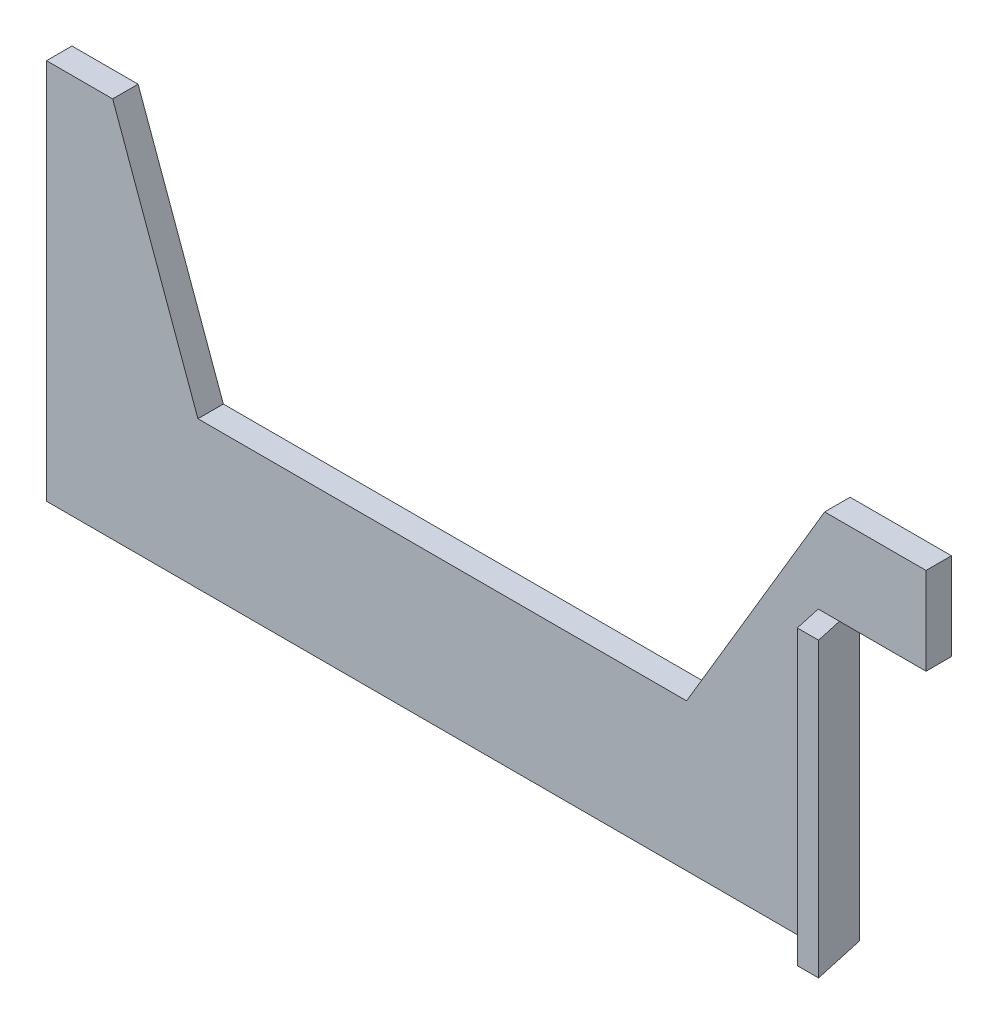
ISO-10303-21;
HEADER;
FILE_DESCRIPTION(('STEP AP214'),'2;1');
FILE_NAME('part.step','',(''),(''),'','','');
FILE_SCHEMA(('AUTOMOTIVE_DESIGN { 1 0 10303 214 1 1 1 1 }'));
ENDSEC;
DATA;
#1=APPLICATION_CONTEXT('core data for automotive mechanical design processes');
#2=APPLICATION_PROTOCOL_DEFINITION('international standard','automotive_design',2000,#1);
#3=PRODUCT_CONTEXT('',#1,'mechanical');
#4=PRODUCT('Part','Part','',(#3));
#5=PRODUCT_RELATED_PRODUCT_CATEGORY('part','',(#4));
#6=PRODUCT_DEFINITION_FORMATION('','',#4);
#7=PRODUCT_DEFINITION_CONTEXT('part definition',#1,'design');
#8=PRODUCT_DEFINITION('design','',#6,#7);
#9=PRODUCT_DEFINITION_SHAPE('','',#8);
#10=(LENGTH_UNIT() NAMED_UNIT(*) SI_UNIT(.MILLI.,.METRE.));
#11=(NAMED_UNIT(*) PLANE_ANGLE_UNIT() SI_UNIT($,.RADIAN.));
#12=(NAMED_UNIT(*) SI_UNIT($,.STERADIAN.) SOLID_ANGLE_UNIT());
#13=UNCERTAINTY_MEASURE_WITH_UNIT(LENGTH_MEASURE(1.E-05),#10,'distance_accuracy_value','');
#14=(GEOMETRIC_REPRESENTATION_CONTEXT(3) GLOBAL_UNCERTAINTY_ASSIGNED_CONTEXT((#13)) GLOBAL_UNIT_ASSIGNED_CONTEXT((#10,
#11,#12)) REPRESENTATION_CONTEXT('',''));
#15=CARTESIAN_POINT('',(0.,0.,0.));
#16=DIRECTION('',(0.,0.,1.));
#17=DIRECTION('',(1.,0.,0.));
#18=AXIS2_PLACEMENT_3D('',#15,#16,#17);
#19=CARTESIAN_POINT('',(39.8970886932972,-6.85517941773865,2.));
#20=DIRECTION('',(0.859998956605666,-0.510295791318295,0.));
#21=DIRECTION('',(0.510295791318295,0.859998956605666,0.));
#22=AXIS2_PLACEMENT_3D('',#19,#20,#21);
#23=PLANE('',#22);
#24=DIRECTION('',(-0.510295791318295,-0.859998956605666,0.));
#25=VECTOR('',#24,1.);
#26=CARTESIAN_POINT('',(39.8970886932972,-6.85517941773865,-2.));
#27=LINE('',#26,#25);
#28=CARTESIAN_POINT('',(61.6068304955443,29.7321403598319,-2.));
#29=VERTEX_POINT('',#28);
#30=CARTESIAN_POINT('',(39.8970886932972,-6.85517941773865,-2.));
#31=VERTEX_POINT('',#30);
#32=EDGE_CURVE('E172',#29,#31,#27,.T.);
#33=ORIENTED_EDGE('',*,*,#32,.T.);
#34=DIRECTION('',(0.,0.,-1.));
#35=VECTOR('',#34,1.);
#36=CARTESIAN_POINT('',(39.8970886932972,-6.85517941773865,2.));
#37=LINE('',#36,#35);
#38=CARTESIAN_POINT('',(39.8970886932972,-6.85517941773865,2.));
#39=VERTEX_POINT('',#38);
#40=EDGE_CURVE('E11',#39,#31,#37,.T.);
#41=ORIENTED_EDGE('',*,*,#40,.F.);
#42=DIRECTION('',(-0.510295791318295,-0.859998956605666,0.));
#43=VECTOR('',#42,1.);
#44=CARTESIAN_POINT('',(39.8970886932972,-6.85517941773865,2.));
#45=LINE('',#44,#43);
#46=CARTESIAN_POINT('',(61.6068304955443,29.7321403598319,2.));
#47=VERTEX_POINT('',#46);
#48=EDGE_CURVE('E152',#47,#39,#45,.T.);
#49=ORIENTED_EDGE('',*,*,#48,.F.);
#50=DIRECTION('',(0.,0.,-1.));
#51=VECTOR('',#50,1.);
#52=CARTESIAN_POINT('',(61.6068304955443,29.7321403598319,2.));
#53=LINE('',#52,#51);
#54=EDGE_CURVE('E171',#47,#29,#53,.T.);
#55=ORIENTED_EDGE('',*,*,#54,.T.);
#56=EDGE_LOOP('',(#33,#41,#49,#55));
#57=FACE_BOUND('',#56,.T.);
#58=ADVANCED_FACE('F33',(#57),#23,.F.);
#59=CARTESIAN_POINT('',(-36.9453705786578,-6.85517941773865,2.));
#60=DIRECTION('',(0.,-1.,0.));
#61=DIRECTION('',(0.,0.,-1.));
#62=AXIS2_PLACEMENT_3D('',#59,#60,#61);
#63=PLANE('',#62);
#64=DIRECTION('',(-1.,0.,0.));
#65=VECTOR('',#64,1.);
#66=CARTESIAN_POINT('',(-36.9453705786578,-6.85517941773865,-2.));
#67=LINE('',#66,#65);
#68=CARTESIAN_POINT('',(-36.9453705786578,-6.85517941773865,-2.));
#69=VERTEX_POINT('',#68);
#70=EDGE_CURVE('E175',#31,#69,#67,.T.);
#71=ORIENTED_EDGE('',*,*,#70,.T.);
#72=DIRECTION('',(0.,0.,-1.));
#73=VECTOR('',#72,1.);
#74=CARTESIAN_POINT('',(-36.9453705786578,-6.85517941773865,2.));
#75=LINE('',#74,#73);
#76=CARTESIAN_POINT('',(-36.9453705786578,-6.85517941773865,2.));
#77=VERTEX_POINT('',#76);
#78=EDGE_CURVE('E40',#77,#69,#75,.T.);
#79=ORIENTED_EDGE('',*,*,#78,.F.);
#80=DIRECTION('',(-1.,0.,0.));
#81=VECTOR('',#80,1.);
#82=CARTESIAN_POINT('',(-36.9453705786578,-6.85517941773865,2.));
#83=LINE('',#82,#81);
#84=EDGE_CURVE('E155',#39,#77,#83,.T.);
#85=ORIENTED_EDGE('',*,*,#84,.F.);
#86=ORIENTED_EDGE('',*,*,#40,.T.);
#87=EDGE_LOOP('',(#71,#79,#85,#86));
#88=FACE_BOUND('',#87,.T.);
#89=ADVANCED_FACE('F237',(#88),#63,.F.);
#90=CARTESIAN_POINT('',(-50.3528774542993,30.,2.));
#91=DIRECTION('',(-0.939747363049318,-0.341869702725838,0.));
#92=DIRECTION('',(0.341869702725838,-0.939747363049318,0.));
#93=AXIS2_PLACEMENT_3D('',#90,#91,#92);
#94=PLANE('',#93);
#95=DIRECTION('',(-0.341869702725838,0.939747363049318,0.));
#96=VECTOR('',#95,1.);
#97=CARTESIAN_POINT('',(-50.3528774542993,30.,-2.));
#98=LINE('',#97,#96);
#99=CARTESIAN_POINT('',(-50.3528774542993,30.,-2.));
#100=VERTEX_POINT('',#99);
#101=EDGE_CURVE('E178',#69,#100,#98,.T.);
#102=ORIENTED_EDGE('',*,*,#101,.T.);
#103=DIRECTION('',(0.,0.,-1.));
#104=VECTOR('',#103,1.);
#105=CARTESIAN_POINT('',(-50.3528774542993,30.,2.));
#106=LINE('',#105,#104);
#107=CARTESIAN_POINT('',(-50.3528774542993,30.,2.));
#108=VERTEX_POINT('',#107);
#109=EDGE_CURVE('E207',#108,#100,#106,.T.);
#110=ORIENTED_EDGE('',*,*,#109,.F.);
#111=DIRECTION('',(-0.341869702725838,0.939747363049318,0.));
#112=VECTOR('',#111,1.);
#113=CARTESIAN_POINT('',(-50.3528774542993,30.,2.));
#114=LINE('',#113,#112);
#115=EDGE_CURVE('E158',#77,#108,#114,.T.);
#116=ORIENTED_EDGE('',*,*,#115,.F.);
#117=ORIENTED_EDGE('',*,*,#78,.T.);
#118=EDGE_LOOP('',(#102,#110,#116,#117));
#119=FACE_BOUND('',#118,.T.);
#120=ADVANCED_FACE('F214',(#119),#94,.F.);
#121=CARTESIAN_POINT('',(-60.75,30.,2.));
#122=DIRECTION('',(0.,-1.,0.));
#123=DIRECTION('',(0.,0.,-1.));
#124=AXIS2_PLACEMENT_3D('',#121,#122,#123);
#125=PLANE('',#124);
#126=DIRECTION('',(-1.,0.,0.));
#127=VECTOR('',#126,1.);
#128=CARTESIAN_POINT('',(-60.75,30.,-2.));
#129=LINE('',#128,#127);
#130=CARTESIAN_POINT('',(-60.75,30.,-2.));
#131=VERTEX_POINT('',#130);
#132=EDGE_CURVE('E180',#100,#131,#129,.T.);
#133=ORIENTED_EDGE('',*,*,#132,.T.);
#134=DIRECTION('',(0.,0.,-1.));
#135=VECTOR('',#134,1.);
#136=CARTESIAN_POINT('',(-60.75,30.,2.));
#137=LINE('',#136,#135);
#138=CARTESIAN_POINT('',(-60.75,30.,2.));
#139=VERTEX_POINT('',#138);
#140=EDGE_CURVE('E204',#139,#131,#137,.T.);
#141=ORIENTED_EDGE('',*,*,#140,.F.);
#142=DIRECTION('',(-1.,0.,0.));
#143=VECTOR('',#142,1.);
#144=CARTESIAN_POINT('',(-60.75,30.,2.));
#145=LINE('',#144,#143);
#146=EDGE_CURVE('E160',#108,#139,#145,.T.);
#147=ORIENTED_EDGE('',*,*,#146,.F.);
#148=ORIENTED_EDGE('',*,*,#109,.T.);
#149=EDGE_LOOP('',(#133,#141,#147,#148));
#150=FACE_BOUND('',#149,.T.);
#151=ADVANCED_FACE('F225',(#150),#125,.F.);
#152=CARTESIAN_POINT('',(-60.75,-30.,2.));
#153=DIRECTION('',(1.,0.,0.));
#154=DIRECTION('',(0.,0.,-1.));
#155=AXIS2_PLACEMENT_3D('',#152,#153,#154);
#156=PLANE('',#155);
#157=DIRECTION('',(0.,-1.,0.));
#158=VECTOR('',#157,1.);
#159=CARTESIAN_POINT('',(-60.75,-30.,-2.));
#160=LINE('',#159,#158);
#161=CARTESIAN_POINT('',(-60.75,-30.,-2.));
#162=VERTEX_POINT('',#161);
#163=EDGE_CURVE('E182',#131,#162,#160,.T.);
#164=ORIENTED_EDGE('',*,*,#163,.T.);
#165=DIRECTION('',(0.,0.,-1.));
#166=VECTOR('',#165,1.);
#167=CARTESIAN_POINT('',(-60.75,-30.,2.));
#168=LINE('',#167,#166);
#169=CARTESIAN_POINT('',(-60.75,-30.,2.));
#170=VERTEX_POINT('',#169);
#171=EDGE_CURVE('E201',#170,#162,#168,.T.);
#172=ORIENTED_EDGE('',*,*,#171,.F.);
#173=DIRECTION('',(0.,-1.,0.));
#174=VECTOR('',#173,1.);
#175=CARTESIAN_POINT('',(-60.75,-30.,2.));
#176=LINE('',#175,#174);
#177=EDGE_CURVE('E162',#139,#170,#176,.T.);
#178=ORIENTED_EDGE('',*,*,#177,.F.);
#179=ORIENTED_EDGE('',*,*,#140,.T.);
#180=EDGE_LOOP('',(#164,#172,#178,#179));
#181=FACE_BOUND('',#180,.T.);
#182=ADVANCED_FACE('F229',(#181),#156,.F.);
#183=CARTESIAN_POINT('',(-60.75,-30.,2.));
#184=DIRECTION('',(0.,1.,0.));
#185=DIRECTION('',(0.,0.,1.));
#186=AXIS2_PLACEMENT_3D('',#183,#184,#185);
#187=PLANE('',#186);
#188=DIRECTION('',(1.,0.,0.));
#189=VECTOR('',#188,1.);
#190=CARTESIAN_POINT('',(-60.75,-30.,-2.));
#191=LINE('',#190,#189);
#192=CARTESIAN_POINT('',(63.0497406042874,-30.,-2.));
#193=VERTEX_POINT('',#192);
#194=EDGE_CURVE('E184',#162,#193,#191,.T.);
#195=ORIENTED_EDGE('',*,*,#194,.T.);
#196=DIRECTION('',(0.216565622731329,0.,0.97626806311125));
#197=VECTOR('',#196,1.);
#198=CARTESIAN_POINT('',(63.0497406042874,-30.,-2.));
#199=LINE('',#198,#197);
#200=CARTESIAN_POINT('',(64.8730272767519,-30.,6.21929411406086));
#201=VERTEX_POINT('',#200);
#202=EDGE_CURVE('E251',#193,#201,#199,.T.);
#203=ORIENTED_EDGE('',*,*,#202,.T.);
#204=DIRECTION('',(-1.,0.,0.));
#205=VECTOR('',#204,1.);
#206=CARTESIAN_POINT('',(64.8730272767519,-30.,6.21929411406086));
#207=LINE('',#206,#205);
#208=CARTESIAN_POINT('',(61.53035014196,-30.,6.21929411406086));
#209=VERTEX_POINT('',#208);
#210=EDGE_CURVE('E146',#201,#209,#207,.T.);
#211=ORIENTED_EDGE('',*,*,#210,.T.);
#212=DIRECTION('',(-0.21656562273133,0.,-0.97626806311125));
#213=VECTOR('',#212,1.);
#214=CARTESIAN_POINT('',(61.53035014196,-30.,6.21929411406086));
#215=LINE('',#214,#213);
#216=CARTESIAN_POINT('',(60.5943837902736,-30.,2.));
#217=VERTEX_POINT('',#216);
#218=EDGE_CURVE('E133',#209,#217,#215,.T.);
#219=ORIENTED_EDGE('',*,*,#218,.T.);
#220=DIRECTION('',(1.,0.,0.));
#221=VECTOR('',#220,1.);
#222=CARTESIAN_POINT('',(-60.75,-30.,2.));
#223=LINE('',#222,#221);
#224=EDGE_CURVE('E164',#170,#217,#223,.T.);
#225=ORIENTED_EDGE('',*,*,#224,.F.);
#226=ORIENTED_EDGE('',*,*,#171,.T.);
#227=EDGE_LOOP('',(#195,#203,#211,#219,#225,#226));
#228=FACE_BOUND('',#227,.T.);
#229=ADVANCED_FACE('F261',(#228),#187,.F.);
#230=CARTESIAN_POINT('',(63.0497406042874,16.,2.));
#231=DIRECTION('',(0.,1.,0.));
#232=DIRECTION('',(-1.,0.,0.));
#233=AXIS2_PLACEMENT_3D('',#230,#231,#232);
#234=PLANE('',#233);
#235=DIRECTION('',(1.,0.,0.));
#236=VECTOR('',#235,1.);
#237=CARTESIAN_POINT('',(63.0497406042874,16.,2.));
#238=LINE('',#237,#236);
#239=CARTESIAN_POINT('',(63.9370609250655,16.,2.));
#240=VERTEX_POINT('',#239);
#241=CARTESIAN_POINT('',(77.5497406042873,16.,2.));
#242=VERTEX_POINT('',#241);
#243=EDGE_CURVE('E55',#240,#242,#238,.T.);
#244=ORIENTED_EDGE('',*,*,#243,.F.);
#245=DIRECTION('',(0.216565622731329,0.,0.97626806311125));
#246=VECTOR('',#245,1.);
#247=CARTESIAN_POINT('',(63.0497406042874,16.,-2.));
#248=LINE('',#247,#246);
#249=CARTESIAN_POINT('',(63.0497406042874,16.,-2.));
#250=VERTEX_POINT('',#249);
#251=EDGE_CURVE('E132',#250,#240,#248,.T.);
#252=ORIENTED_EDGE('',*,*,#251,.F.);
#253=DIRECTION('',(1.,0.,0.));
#254=VECTOR('',#253,1.);
#255=CARTESIAN_POINT('',(63.0497406042874,16.,-2.));
#256=LINE('',#255,#254);
#257=CARTESIAN_POINT('',(77.5497406042873,16.,-2.));
#258=VERTEX_POINT('',#257);
#259=EDGE_CURVE('E188',#250,#258,#256,.T.);
#260=ORIENTED_EDGE('',*,*,#259,.T.);
#261=DIRECTION('',(0.,0.,-1.));
#262=VECTOR('',#261,1.);
#263=CARTESIAN_POINT('',(77.5497406042873,16.,2.));
#264=LINE('',#263,#262);
#265=EDGE_CURVE('E198',#242,#258,#264,.T.);
#266=ORIENTED_EDGE('',*,*,#265,.F.);
#267=EDGE_LOOP('',(#244,#252,#260,#266));
#268=FACE_BOUND('',#267,.T.);
#269=ADVANCED_FACE('F249',(#268),#234,.F.);
#270=CARTESIAN_POINT('',(77.5497406042874,29.7321403598319,2.));
#271=DIRECTION('',(-1.,0.,0.));
#272=DIRECTION('',(0.,-1.,0.));
#273=AXIS2_PLACEMENT_3D('',#270,#271,#272);
#274=PLANE('',#273);
#275=DIRECTION('',(0.,1.,0.));
#276=VECTOR('',#275,1.);
#277=CARTESIAN_POINT('',(77.5497406042874,29.7321403598319,-2.));
#278=LINE('',#277,#276);
#279=CARTESIAN_POINT('',(77.5497406042874,29.7321403598319,-2.));
#280=VERTEX_POINT('',#279);
#281=EDGE_CURVE('E190',#258,#280,#278,.T.);
#282=ORIENTED_EDGE('',*,*,#281,.T.);
#283=DIRECTION('',(0.,0.,-1.));
#284=VECTOR('',#283,1.);
#285=CARTESIAN_POINT('',(77.5497406042874,29.7321403598319,2.));
#286=LINE('',#285,#284);
#287=CARTESIAN_POINT('',(77.5497406042874,29.7321403598319,2.));
#288=VERTEX_POINT('',#287);
#289=EDGE_CURVE('E195',#288,#280,#286,.T.);
#290=ORIENTED_EDGE('',*,*,#289,.F.);
#291=DIRECTION('',(0.,1.,0.));
#292=VECTOR('',#291,1.);
#293=CARTESIAN_POINT('',(77.5497406042874,29.7321403598319,2.));
#294=LINE('',#293,#292);
#295=EDGE_CURVE('E167',#242,#288,#294,.T.);
#296=ORIENTED_EDGE('',*,*,#295,.F.);
#297=ORIENTED_EDGE('',*,*,#265,.T.);
#298=EDGE_LOOP('',(#282,#290,#296,#297));
#299=FACE_BOUND('',#298,.T.);
#300=ADVANCED_FACE('F248',(#299),#274,.F.);
#301=CARTESIAN_POINT('',(61.6068304955443,29.7321403598319,2.));
#302=DIRECTION('',(0.,-1.,0.));
#303=DIRECTION('',(0.,0.,-1.));
#304=AXIS2_PLACEMENT_3D('',#301,#302,#303);
#305=PLANE('',#304);
#306=DIRECTION('',(-1.,0.,0.));
#307=VECTOR('',#306,1.);
#308=CARTESIAN_POINT('',(61.6068304955443,29.7321403598319,-2.));
#309=LINE('',#308,#307);
#310=EDGE_CURVE('E156',#280,#29,#309,.T.);
#311=ORIENTED_EDGE('',*,*,#310,.T.);
#312=ORIENTED_EDGE('',*,*,#54,.F.);
#313=DIRECTION('',(-1.,0.,0.));
#314=VECTOR('',#313,1.);
#315=CARTESIAN_POINT('',(61.6068304955443,29.7321403598319,2.));
#316=LINE('',#315,#314);
#317=EDGE_CURVE('E169',#288,#47,#316,.T.);
#318=ORIENTED_EDGE('',*,*,#317,.F.);
#319=ORIENTED_EDGE('',*,*,#289,.T.);
#320=EDGE_LOOP('',(#311,#312,#318,#319));
#321=FACE_BOUND('',#320,.T.);
#322=ADVANCED_FACE('F243',(#321),#305,.F.);
#323=CARTESIAN_POINT('',(0.,0.,2.));
#324=DIRECTION('',(0.,0.,-1.));
#325=DIRECTION('',(-1.,0.,0.));
#326=AXIS2_PLACEMENT_3D('',#323,#324,#325);
#327=PLANE('',#326);
#328=DIRECTION('',(0.,-1.,0.));
#329=VECTOR('',#328,1.);
#330=CARTESIAN_POINT('',(60.5943837902736,25.2662606167655,2.));
#331=LINE('',#330,#329);
#332=CARTESIAN_POINT('',(60.5943837902736,16.,2.));
#333=VERTEX_POINT('',#332);
#334=EDGE_CURVE('E176',#333,#217,#331,.T.);
#335=ORIENTED_EDGE('',*,*,#334,.F.);
#336=EDGE_CURVE('E47',#333,#240,#238,.T.);
#337=ORIENTED_EDGE('',*,*,#336,.T.);
#338=ORIENTED_EDGE('',*,*,#243,.T.);
#339=ORIENTED_EDGE('',*,*,#295,.T.);
#340=ORIENTED_EDGE('',*,*,#317,.T.);
#341=ORIENTED_EDGE('',*,*,#48,.T.);
#342=ORIENTED_EDGE('',*,*,#84,.T.);
#343=ORIENTED_EDGE('',*,*,#115,.T.);
#344=ORIENTED_EDGE('',*,*,#146,.T.);
#345=ORIENTED_EDGE('',*,*,#177,.T.);
#346=ORIENTED_EDGE('',*,*,#224,.T.);
#347=EDGE_LOOP('',(#335,#337,#338,#339,#340,#341,#342,#343,#344,#345,#346));
#348=FACE_BOUND('',#347,.T.);
#349=ADVANCED_FACE('F233',(#348),#327,.F.);
#350=CARTESIAN_POINT('',(0.,0.,-2.));
#351=DIRECTION('',(0.,0.,-1.));
#352=DIRECTION('',(-1.,0.,0.));
#353=AXIS2_PLACEMENT_3D('',#350,#351,#352);
#354=PLANE('',#353);
#355=ORIENTED_EDGE('',*,*,#32,.F.);
#356=ORIENTED_EDGE('',*,*,#310,.F.);
#357=ORIENTED_EDGE('',*,*,#281,.F.);
#358=ORIENTED_EDGE('',*,*,#259,.F.);
#359=DIRECTION('',(0.,1.,0.));
#360=VECTOR('',#359,1.);
#361=CARTESIAN_POINT('',(63.0497406042874,-30.,-2.));
#362=LINE('',#361,#360);
#363=EDGE_CURVE('E186',#193,#250,#362,.T.);
#364=ORIENTED_EDGE('',*,*,#363,.F.);
#365=ORIENTED_EDGE('',*,*,#194,.F.);
#366=ORIENTED_EDGE('',*,*,#163,.F.);
#367=ORIENTED_EDGE('',*,*,#132,.F.);
#368=ORIENTED_EDGE('',*,*,#101,.F.);
#369=ORIENTED_EDGE('',*,*,#70,.F.);
#370=EDGE_LOOP('',(#355,#356,#357,#358,#364,#365,#366,#367,#368,#369));
#371=FACE_BOUND('',#370,.T.);
#372=ADVANCED_FACE('F220',(#371),#354,.T.);
#373=CARTESIAN_POINT('',(63.0497406042874,16.,2.));
#374=DIRECTION('',(0.,1.,0.));
#375=DIRECTION('',(-1.,0.,0.));
#376=AXIS2_PLACEMENT_3D('',#373,#374,#375);
#377=PLANE('',#376);
#378=ORIENTED_EDGE('',*,*,#336,.F.);
#379=DIRECTION('',(-0.21656562273133,0.,-0.97626806311125));
#380=VECTOR('',#379,1.);
#381=CARTESIAN_POINT('',(61.53035014196,16.,6.21929411406086));
#382=LINE('',#381,#380);
#383=CARTESIAN_POINT('',(61.53035014196,16.,6.21929411406086));
#384=VERTEX_POINT('',#383);
#385=EDGE_CURVE('E139',#384,#333,#382,.T.);
#386=ORIENTED_EDGE('',*,*,#385,.F.);
#387=DIRECTION('',(-1.,0.,0.));
#388=VECTOR('',#387,1.);
#389=CARTESIAN_POINT('',(64.8730272767519,16.,6.21929411406086));
#390=LINE('',#389,#388);
#391=CARTESIAN_POINT('',(64.8730272767519,16.,6.21929411406086));
#392=VERTEX_POINT('',#391);
#393=EDGE_CURVE('E136',#392,#384,#390,.T.);
#394=ORIENTED_EDGE('',*,*,#393,.F.);
#395=EDGE_CURVE('E124',#240,#392,#248,.T.);
#396=ORIENTED_EDGE('',*,*,#395,.F.);
#397=EDGE_LOOP('',(#378,#386,#394,#396));
#398=FACE_BOUND('',#397,.T.);
#399=ADVANCED_FACE('F137',(#398),#377,.T.);
#400=CARTESIAN_POINT('',(63.0497406042874,25.2662606167655,-2.));
#401=DIRECTION('',(0.97626806311125,0.,-0.216565622731329));
#402=DIRECTION('',(-0.216565622731329,0.,-0.97626806311125));
#403=AXIS2_PLACEMENT_3D('',#400,#401,#402);
#404=PLANE('',#403);
#405=ORIENTED_EDGE('',*,*,#363,.T.);
#406=ORIENTED_EDGE('',*,*,#251,.T.);
#407=ORIENTED_EDGE('',*,*,#395,.T.);
#408=DIRECTION('',(0.,-1.,0.));
#409=VECTOR('',#408,1.);
#410=CARTESIAN_POINT('',(64.8730272767519,25.2662606167655,6.21929411406086));
#411=LINE('',#410,#409);
#412=EDGE_CURVE('E130',#392,#201,#411,.T.);
#413=ORIENTED_EDGE('',*,*,#412,.T.);
#414=ORIENTED_EDGE('',*,*,#202,.F.);
#415=EDGE_LOOP('',(#405,#406,#407,#413,#414));
#416=FACE_BOUND('',#415,.T.);
#417=ADVANCED_FACE('F127',(#416),#404,.T.);
#418=CARTESIAN_POINT('',(64.8730272767519,25.2662606167655,6.21929411406086));
#419=DIRECTION('',(0.,0.,1.));
#420=DIRECTION('',(1.,0.,0.));
#421=AXIS2_PLACEMENT_3D('',#418,#419,#420);
#422=PLANE('',#421);
#423=ORIENTED_EDGE('',*,*,#412,.F.);
#424=ORIENTED_EDGE('',*,*,#393,.T.);
#425=DIRECTION('',(0.,-1.,0.));
#426=VECTOR('',#425,1.);
#427=CARTESIAN_POINT('',(61.53035014196,25.2662606167655,6.21929411406086));
#428=LINE('',#427,#426);
#429=EDGE_CURVE('E142',#384,#209,#428,.T.);
#430=ORIENTED_EDGE('',*,*,#429,.T.);
#431=ORIENTED_EDGE('',*,*,#210,.F.);
#432=EDGE_LOOP('',(#423,#424,#430,#431));
#433=FACE_BOUND('',#432,.T.);
#434=ADVANCED_FACE('F144',(#433),#422,.T.);
#435=CARTESIAN_POINT('',(61.53035014196,25.2662606167655,6.21929411406086));
#436=DIRECTION('',(-0.97626806311125,0.,0.21656562273133));
#437=DIRECTION('',(0.21656562273133,0.,0.97626806311125));
#438=AXIS2_PLACEMENT_3D('',#435,#436,#437);
#439=PLANE('',#438);
#440=ORIENTED_EDGE('',*,*,#429,.F.);
#441=ORIENTED_EDGE('',*,*,#385,.T.);
#442=ORIENTED_EDGE('',*,*,#334,.T.);
#443=ORIENTED_EDGE('',*,*,#218,.F.);
#444=EDGE_LOOP('',(#440,#441,#442,#443));
#445=FACE_BOUND('',#444,.T.);
#446=ADVANCED_FACE('F260',(#445),#439,.T.);
#447=CLOSED_SHELL('',(#58,#89,#120,#151,#182,#229,#269,#300,#322,#349,#372,#399,#417,#434,#446));
#448=MANIFOLD_SOLID_BREP('B2',#447);
#449=ADVANCED_BREP_SHAPE_REPRESENTATION('',(#18,#448),#14);
#450=SHAPE_DEFINITION_REPRESENTATION(#9,#449);
ENDSEC;
END-ISO-10303-21;
